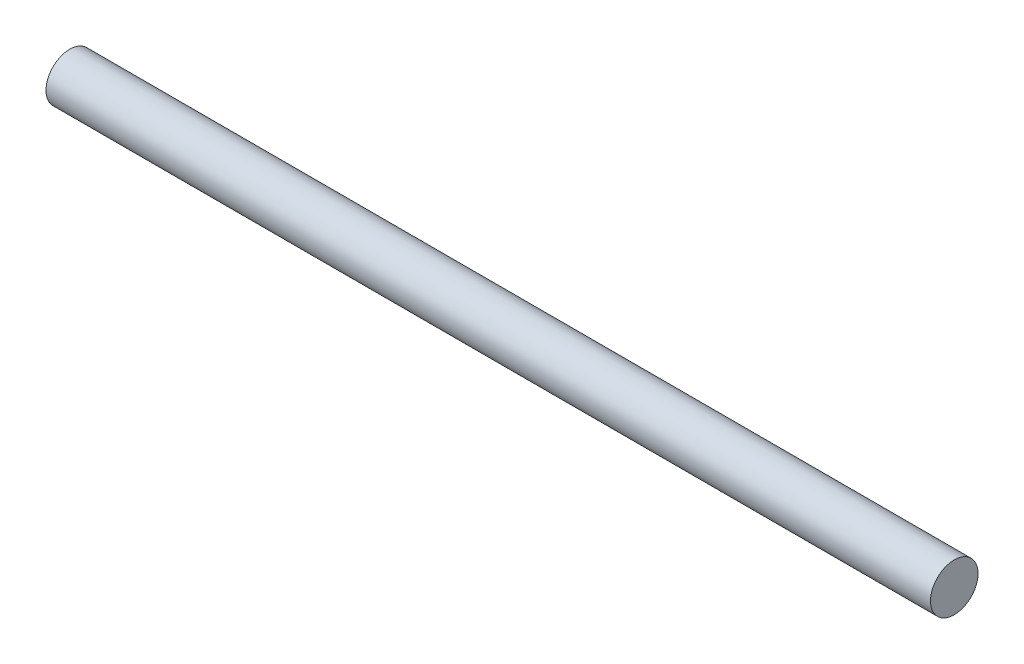
ISO-10303-21;
HEADER;
FILE_DESCRIPTION(('STEP AP214'),'2;1');
FILE_NAME('part.step','',(''),(''),'','','');
FILE_SCHEMA(('AUTOMOTIVE_DESIGN { 1 0 10303 214 1 1 1 1 }'));
ENDSEC;
DATA;
#1=APPLICATION_CONTEXT('core data for automotive mechanical design processes');
#2=APPLICATION_PROTOCOL_DEFINITION('international standard','automotive_design',2000,#1);
#3=PRODUCT_CONTEXT('',#1,'mechanical');
#4=PRODUCT('Part','Part','',(#3));
#5=PRODUCT_RELATED_PRODUCT_CATEGORY('part','',(#4));
#6=PRODUCT_DEFINITION_FORMATION('','',#4);
#7=PRODUCT_DEFINITION_CONTEXT('part definition',#1,'design');
#8=PRODUCT_DEFINITION('design','',#6,#7);
#9=PRODUCT_DEFINITION_SHAPE('','',#8);
#10=(LENGTH_UNIT() NAMED_UNIT(*) SI_UNIT(.MILLI.,.METRE.));
#11=(NAMED_UNIT(*) PLANE_ANGLE_UNIT() SI_UNIT($,.RADIAN.));
#12=(NAMED_UNIT(*) SI_UNIT($,.STERADIAN.) SOLID_ANGLE_UNIT());
#13=UNCERTAINTY_MEASURE_WITH_UNIT(LENGTH_MEASURE(1.E-05),#10,'distance_accuracy_value','');
#14=(GEOMETRIC_REPRESENTATION_CONTEXT(3) GLOBAL_UNCERTAINTY_ASSIGNED_CONTEXT((#13)) GLOBAL_UNIT_ASSIGNED_CONTEXT((#10,
#11,#12)) REPRESENTATION_CONTEXT('',''));
#15=CARTESIAN_POINT('',(0.,0.,0.));
#16=DIRECTION('',(0.,0.,1.));
#17=DIRECTION('',(1.,0.,0.));
#18=AXIS2_PLACEMENT_3D('',#15,#16,#17);
#19=CARTESIAN_POINT('',(46.5,0.,0.));
#20=DIRECTION('',(-1.,0.,0.));
#21=DIRECTION('',(0.,0.,1.));
#22=AXIS2_PLACEMENT_3D('',#19,#20,#21);
#23=CYLINDRICAL_SURFACE('',#22,2.5);
#24=CARTESIAN_POINT('',(46.5,0.,0.));
#25=DIRECTION('',(1.,0.,0.));
#26=DIRECTION('',(0.,0.,-1.));
#27=AXIS2_PLACEMENT_3D('',#24,#25,#26);
#28=CIRCLE('',#27,2.5);
#29=CARTESIAN_POINT('',(46.5,0.,2.5));
#30=VERTEX_POINT('',#29);
#31=EDGE_CURVE('E10',#30,#30,#28,.T.);
#32=CARTESIAN_POINT('',(-46.5,0.,0.));
#33=DIRECTION('',(1.,0.,0.));
#34=DIRECTION('',(0.,0.,-1.));
#35=AXIS2_PLACEMENT_3D('',#32,#33,#34);
#36=CIRCLE('',#35,2.5);
#37=CARTESIAN_POINT('',(-46.5,0.,2.5));
#38=VERTEX_POINT('',#37);
#39=EDGE_CURVE('E38',#38,#38,#36,.T.);
#40=CARTESIAN_POINT('',(46.5,0.,2.5));
#41=CARTESIAN_POINT('',(45.53125,0.,2.5));
#42=CARTESIAN_POINT('',(44.5625,0.,2.5));
#43=CARTESIAN_POINT('',(42.625,0.,2.5));
#44=CARTESIAN_POINT('',(41.65625,0.,2.5));
#45=CARTESIAN_POINT('',(39.71875,0.,2.5));
#46=CARTESIAN_POINT('',(38.75,0.,2.5));
#47=CARTESIAN_POINT('',(36.8125,0.,2.5));
#48=CARTESIAN_POINT('',(35.84375,0.,2.5));
#49=CARTESIAN_POINT('',(33.90625,0.,2.5));
#50=CARTESIAN_POINT('',(32.9375,0.,2.5));
#51=CARTESIAN_POINT('',(31.,0.,2.5));
#52=CARTESIAN_POINT('',(30.03125,0.,2.5));
#53=CARTESIAN_POINT('',(28.09375,0.,2.5));
#54=CARTESIAN_POINT('',(27.125,0.,2.5));
#55=CARTESIAN_POINT('',(25.1875,0.,2.5));
#56=CARTESIAN_POINT('',(24.21875,0.,2.5));
#57=CARTESIAN_POINT('',(22.28125,0.,2.5));
#58=CARTESIAN_POINT('',(21.3125,0.,2.5));
#59=CARTESIAN_POINT('',(19.375,0.,2.5));
#60=CARTESIAN_POINT('',(18.40625,0.,2.5));
#61=CARTESIAN_POINT('',(16.46875,0.,2.5));
#62=CARTESIAN_POINT('',(15.5,0.,2.5));
#63=CARTESIAN_POINT('',(13.5625,0.,2.5));
#64=CARTESIAN_POINT('',(12.59375,0.,2.5));
#65=CARTESIAN_POINT('',(10.65625,0.,2.5));
#66=CARTESIAN_POINT('',(9.6875,0.,2.5));
#67=CARTESIAN_POINT('',(7.75,0.,2.5));
#68=CARTESIAN_POINT('',(6.78124999999999,0.,2.5));
#69=CARTESIAN_POINT('',(4.84374999999999,0.,2.5));
#70=CARTESIAN_POINT('',(3.87499999999999,0.,2.5));
#71=CARTESIAN_POINT('',(1.93749999999999,0.,2.5));
#72=CARTESIAN_POINT('',(0.968749999999993,0.,2.5));
#73=CARTESIAN_POINT('',(-0.968750000000007,0.,2.5));
#74=CARTESIAN_POINT('',(-1.93750000000001,0.,2.5));
#75=CARTESIAN_POINT('',(-3.87500000000001,0.,2.5));
#76=CARTESIAN_POINT('',(-4.84375000000001,0.,2.5));
#77=CARTESIAN_POINT('',(-6.78125000000001,0.,2.5));
#78=CARTESIAN_POINT('',(-7.75000000000001,0.,2.5));
#79=CARTESIAN_POINT('',(-9.68750000000001,0.,2.5));
#80=CARTESIAN_POINT('',(-10.65625,0.,2.5));
#81=CARTESIAN_POINT('',(-12.59375,0.,2.5));
#82=CARTESIAN_POINT('',(-13.5625,0.,2.5));
#83=CARTESIAN_POINT('',(-15.5,0.,2.5));
#84=CARTESIAN_POINT('',(-16.46875,0.,2.5));
#85=CARTESIAN_POINT('',(-18.40625,0.,2.5));
#86=CARTESIAN_POINT('',(-19.375,0.,2.5));
#87=CARTESIAN_POINT('',(-21.3125,0.,2.5));
#88=CARTESIAN_POINT('',(-22.28125,0.,2.5));
#89=CARTESIAN_POINT('',(-24.21875,0.,2.5));
#90=CARTESIAN_POINT('',(-25.1875,0.,2.5));
#91=CARTESIAN_POINT('',(-27.125,0.,2.5));
#92=CARTESIAN_POINT('',(-28.09375,0.,2.5));
#93=CARTESIAN_POINT('',(-30.03125,0.,2.5));
#94=CARTESIAN_POINT('',(-31.,0.,2.5));
#95=CARTESIAN_POINT('',(-32.9375,0.,2.5));
#96=CARTESIAN_POINT('',(-33.90625,0.,2.5));
#97=CARTESIAN_POINT('',(-35.84375,0.,2.5));
#98=CARTESIAN_POINT('',(-36.8125,0.,2.5));
#99=CARTESIAN_POINT('',(-38.75,0.,2.5));
#100=CARTESIAN_POINT('',(-39.71875,0.,2.5));
#101=CARTESIAN_POINT('',(-41.65625,0.,2.5));
#102=CARTESIAN_POINT('',(-42.625,0.,2.5));
#103=CARTESIAN_POINT('',(-44.5625,0.,2.5));
#104=CARTESIAN_POINT('',(-45.53125,0.,2.5));
#105=CARTESIAN_POINT('',(-46.5,0.,2.5));
#106=B_SPLINE_CURVE_WITH_KNOTS('',3,(#40,#41,#42,#43,#44,#45,#46,#47,#48,#49,#50,#51,#52,#53,
#54,#55,#56,#57,#58,#59,#60,#61,#62,#63,#64,#65,#66,#67,#68,#69,#70,#71,#72,#73,#74,#75,#76,#77,
#78,#79,#80,#81,#82,#83,#84,#85,#86,#87,#88,#89,#90,#91,#92,#93,#94,#95,#96,#97,#98,#99,#100,
#101,#102,#103,#104,#105),.UNSPECIFIED.,.F.,.F.,(4,2,2,2,2,2,2,2,2,2,2,2,2,2,2,2,2,2,2,2,2,2,2,
2,2,2,2,2,2,2,2,2,4),(0.,2.90625000000001,5.81250000000001,8.71875,11.625,14.53125,17.4375,
20.34375,23.25,26.15625,29.0625,31.96875,34.875,37.78125,40.6875,43.59375,46.5,49.40625,52.3125,
55.21875,58.125,61.03125,63.9375,66.84375,69.75,72.65625,75.5625,78.46875,81.375,84.28125,
87.1875,90.09375,93.),.UNSPECIFIED.);
#107=EDGE_CURVE('BSEAM35',#30,#38,#106,.T.);
#108=ORIENTED_EDGE('',*,*,#31,.F.);
#109=ORIENTED_EDGE('',*,*,#39,.T.);
#110=ORIENTED_EDGE('',*,*,#107,.T.);
#111=ORIENTED_EDGE('',*,*,#107,.F.);
#112=EDGE_LOOP('',(#108,#110,#109,#111));
#113=FACE_BOUND('',#112,.T.);
#114=ADVANCED_FACE('F35',(#113),#23,.T.);
#115=CARTESIAN_POINT('',(46.5,0.,0.));
#116=DIRECTION('',(1.,0.,0.));
#117=DIRECTION('',(0.,0.,-1.));
#118=AXIS2_PLACEMENT_3D('',#115,#116,#117);
#119=PLANE('',#118);
#120=ORIENTED_EDGE('',*,*,#31,.T.);
#121=EDGE_LOOP('',(#120));
#122=FACE_BOUND('',#121,.T.);
#123=ADVANCED_FACE('F50',(#122),#119,.T.);
#124=CARTESIAN_POINT('',(-46.5,0.,0.));
#125=DIRECTION('',(1.,0.,0.));
#126=DIRECTION('',(0.,0.,-1.));
#127=AXIS2_PLACEMENT_3D('',#124,#125,#126);
#128=PLANE('',#127);
#129=ORIENTED_EDGE('',*,*,#39,.F.);
#130=EDGE_LOOP('',(#129));
#131=FACE_BOUND('',#130,.T.);
#132=ADVANCED_FACE('F48',(#131),#128,.F.);
#133=CLOSED_SHELL('',(#114,#123,#132));
#134=MANIFOLD_SOLID_BREP('B2',#133);
#135=ADVANCED_BREP_SHAPE_REPRESENTATION('',(#18,#134),#14);
#136=SHAPE_DEFINITION_REPRESENTATION(#9,#135);
ENDSEC;
END-ISO-10303-21;
